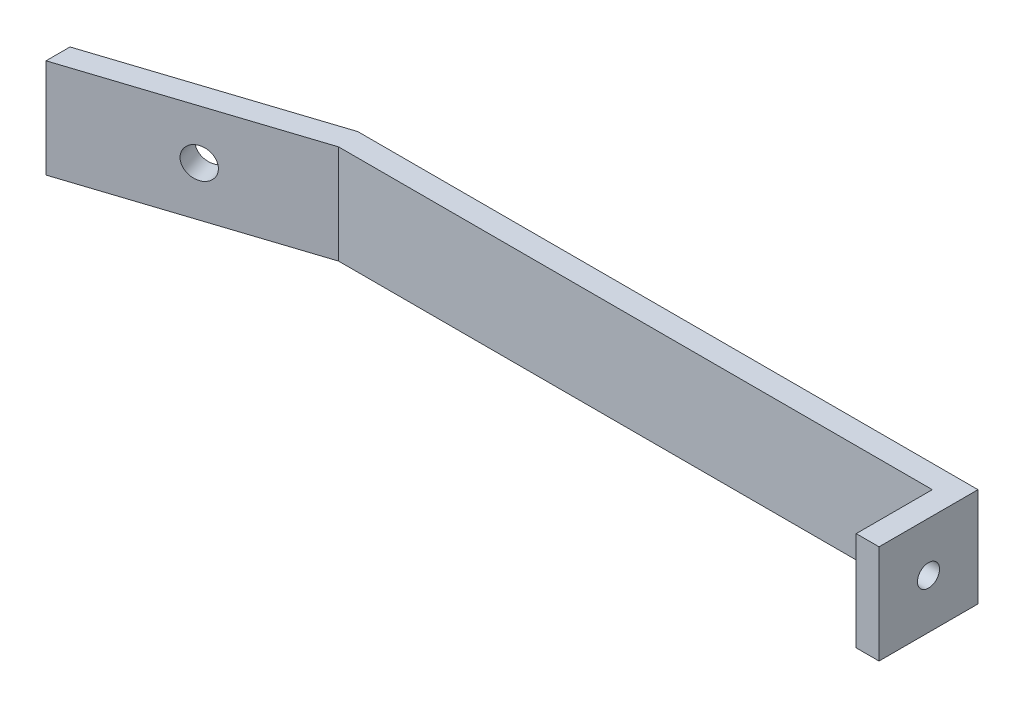
ISO-10303-21;
HEADER;
FILE_DESCRIPTION(('STEP AP214'),'2;1');
FILE_NAME('part.step','',(''),(''),'','','');
FILE_SCHEMA(('AUTOMOTIVE_DESIGN { 1 0 10303 214 1 1 1 1 }'));
ENDSEC;
DATA;
#1=APPLICATION_CONTEXT('core data for automotive mechanical design processes');
#2=APPLICATION_PROTOCOL_DEFINITION('international standard','automotive_design',2000,#1);
#3=PRODUCT_CONTEXT('',#1,'mechanical');
#4=PRODUCT('Part','Part','',(#3));
#5=PRODUCT_RELATED_PRODUCT_CATEGORY('part','',(#4));
#6=PRODUCT_DEFINITION_FORMATION('','',#4);
#7=PRODUCT_DEFINITION_CONTEXT('part definition',#1,'design');
#8=PRODUCT_DEFINITION('design','',#6,#7);
#9=PRODUCT_DEFINITION_SHAPE('','',#8);
#10=(LENGTH_UNIT() NAMED_UNIT(*) SI_UNIT(.MILLI.,.METRE.));
#11=(NAMED_UNIT(*) PLANE_ANGLE_UNIT() SI_UNIT($,.RADIAN.));
#12=(NAMED_UNIT(*) SI_UNIT($,.STERADIAN.) SOLID_ANGLE_UNIT());
#13=UNCERTAINTY_MEASURE_WITH_UNIT(LENGTH_MEASURE(1.E-05),#10,'distance_accuracy_value','');
#14=(GEOMETRIC_REPRESENTATION_CONTEXT(3) GLOBAL_UNCERTAINTY_ASSIGNED_CONTEXT((#13)) GLOBAL_UNIT_ASSIGNED_CONTEXT((#10,
#11,#12)) REPRESENTATION_CONTEXT('',''));
#15=CARTESIAN_POINT('',(0.,0.,0.));
#16=DIRECTION('',(0.,0.,1.));
#17=DIRECTION('',(1.,0.,0.));
#18=AXIS2_PLACEMENT_3D('',#15,#16,#17);
#19=CARTESIAN_POINT('',(55.,6.5,3.));
#20=DIRECTION('',(0.,0.,-1.));
#21=DIRECTION('',(-1.,0.,0.));
#22=AXIS2_PLACEMENT_3D('',#19,#20,#21);
#23=PLANE('',#22);
#24=DIRECTION('',(0.,-1.,0.));
#25=VECTOR('',#24,1.);
#26=CARTESIAN_POINT('',(52.,6.5,2.99999999999999));
#27=LINE('',#26,#25);
#28=CARTESIAN_POINT('',(52.,6.5,3.));
#29=VERTEX_POINT('',#28);
#30=CARTESIAN_POINT('',(52.,-6.5,3.));
#31=VERTEX_POINT('',#30);
#32=EDGE_CURVE('E51',#29,#31,#27,.T.);
#33=ORIENTED_EDGE('',*,*,#32,.F.);
#34=DIRECTION('',(1.,0.,0.));
#35=VECTOR('',#34,1.);
#36=CARTESIAN_POINT('',(55.,6.5,3.));
#37=LINE('',#36,#35);
#38=CARTESIAN_POINT('',(-25.9931511901718,6.5,2.99999999999998));
#39=VERTEX_POINT('',#38);
#40=EDGE_CURVE('E138',#39,#29,#37,.T.);
#41=ORIENTED_EDGE('',*,*,#40,.F.);
#42=DIRECTION('',(0.,-1.,0.));
#43=VECTOR('',#42,1.);
#44=CARTESIAN_POINT('',(-25.9931511901718,6.5,2.99999999999998));
#45=LINE('',#44,#43);
#46=CARTESIAN_POINT('',(-25.9931511901718,-6.5,2.99999999999998));
#47=VERTEX_POINT('',#46);
#48=EDGE_CURVE('E145',#39,#47,#45,.T.);
#49=ORIENTED_EDGE('',*,*,#48,.T.);
#50=DIRECTION('',(1.,0.,0.));
#51=VECTOR('',#50,1.);
#52=CARTESIAN_POINT('',(55.,-6.5,3.));
#53=LINE('',#52,#51);
#54=EDGE_CURVE('E56',#47,#31,#53,.T.);
#55=ORIENTED_EDGE('',*,*,#54,.T.);
#56=EDGE_LOOP('',(#33,#41,#49,#55));
#57=FACE_BOUND('',#56,.T.);
#58=ADVANCED_FACE('F34',(#57),#23,.F.);
#59=CARTESIAN_POINT('',(55.,6.5,50.));
#60=DIRECTION('',(-1.,0.,0.));
#61=DIRECTION('',(0.,0.,1.));
#62=AXIS2_PLACEMENT_3D('',#59,#60,#61);
#63=PLANE('',#62);
#64=CARTESIAN_POINT('',(55.,0.,6.5));
#65=DIRECTION('',(1.,0.,0.));
#66=DIRECTION('',(0.,0.,-1.));
#67=AXIS2_PLACEMENT_3D('',#64,#65,#66);
#68=CIRCLE('',#67,1.44883841646071);
#69=CARTESIAN_POINT('',(55.,0.,5.05116158353929));
#70=VERTEX_POINT('',#69);
#71=EDGE_CURVE('E124',#70,#70,#68,.T.);
#72=ORIENTED_EDGE('',*,*,#71,.F.);
#73=EDGE_LOOP('',(#72));
#74=FACE_BOUND('',#73,.T.);
#75=DIRECTION('',(0.,0.,-1.));
#76=VECTOR('',#75,1.);
#77=CARTESIAN_POINT('',(55.,6.5,50.));
#78=LINE('',#77,#76);
#79=CARTESIAN_POINT('',(55.,6.5,13.));
#80=VERTEX_POINT('',#79);
#81=CARTESIAN_POINT('',(55.,6.5,0.));
#82=VERTEX_POINT('',#81);
#83=EDGE_CURVE('E11',#80,#82,#78,.T.);
#84=ORIENTED_EDGE('',*,*,#83,.F.);
#85=DIRECTION('',(0.,1.,0.));
#86=VECTOR('',#85,1.);
#87=CARTESIAN_POINT('',(55.,6.5,13.));
#88=LINE('',#87,#86);
#89=CARTESIAN_POINT('',(55.,-6.5,13.));
#90=VERTEX_POINT('',#89);
#91=EDGE_CURVE('E101',#90,#80,#88,.T.);
#92=ORIENTED_EDGE('',*,*,#91,.F.);
#93=DIRECTION('',(0.,0.,-1.));
#94=VECTOR('',#93,1.);
#95=CARTESIAN_POINT('',(55.,-6.5,50.));
#96=LINE('',#95,#94);
#97=CARTESIAN_POINT('',(55.,-6.5,0.));
#98=VERTEX_POINT('',#97);
#99=EDGE_CURVE('E165',#90,#98,#96,.T.);
#100=ORIENTED_EDGE('',*,*,#99,.T.);
#101=DIRECTION('',(0.,1.,0.));
#102=VECTOR('',#101,1.);
#103=CARTESIAN_POINT('',(55.,6.5,0.));
#104=LINE('',#103,#102);
#105=EDGE_CURVE('E103',#98,#82,#104,.T.);
#106=ORIENTED_EDGE('',*,*,#105,.T.);
#107=EDGE_LOOP('',(#84,#92,#100,#106));
#108=FACE_BOUND('',#107,.T.);
#109=ADVANCED_FACE('F36',(#74,#108),#63,.F.);
#110=CARTESIAN_POINT('',(-55.,6.5,50.));
#111=DIRECTION('',(0.,-1.,0.));
#112=DIRECTION('',(0.,0.,-1.));
#113=AXIS2_PLACEMENT_3D('',#110,#111,#112);
#114=PLANE('',#113);
#115=DIRECTION('',(0.951056516295153,0.,-0.309016994374948));
#116=VECTOR('',#115,1.);
#117=CARTESIAN_POINT('',(-55.,6.5,12.4248965039633));
#118=LINE('',#117,#116);
#119=CARTESIAN_POINT('',(-55.,6.5,12.4248965039633));
#120=VERTEX_POINT('',#119);
#121=EDGE_CURVE('E136',#120,#39,#118,.T.);
#122=ORIENTED_EDGE('',*,*,#121,.T.);
#123=ORIENTED_EDGE('',*,*,#40,.T.);
#124=DIRECTION('',(0.,0.,-1.));
#125=VECTOR('',#124,1.);
#126=CARTESIAN_POINT('',(52.,6.5,13.));
#127=LINE('',#126,#125);
#128=CARTESIAN_POINT('',(52.,6.5,13.));
#129=VERTEX_POINT('',#128);
#130=EDGE_CURVE('E112',#129,#29,#127,.T.);
#131=ORIENTED_EDGE('',*,*,#130,.F.);
#132=DIRECTION('',(-1.,0.,0.));
#133=VECTOR('',#132,1.);
#134=CARTESIAN_POINT('',(55.,6.5,13.));
#135=LINE('',#134,#133);
#136=EDGE_CURVE('E108',#80,#129,#135,.T.);
#137=ORIENTED_EDGE('',*,*,#136,.F.);
#138=ORIENTED_EDGE('',*,*,#83,.T.);
#139=DIRECTION('',(-1.,0.,0.));
#140=VECTOR('',#139,1.);
#141=CARTESIAN_POINT('',(-55.,6.5,0.));
#142=LINE('',#141,#140);
#143=CARTESIAN_POINT('',(-26.4683045111454,6.5,0.));
#144=VERTEX_POINT('',#143);
#145=EDGE_CURVE('E160',#82,#144,#142,.T.);
#146=ORIENTED_EDGE('',*,*,#145,.T.);
#147=DIRECTION('',(-0.951056516295153,0.,0.309016994374948));
#148=VECTOR('',#147,1.);
#149=CARTESIAN_POINT('',(-55.,6.5,9.27050983124845));
#150=LINE('',#149,#148);
#151=CARTESIAN_POINT('',(-55.,6.5,9.27050983124845));
#152=VERTEX_POINT('',#151);
#153=EDGE_CURVE('E149',#144,#152,#150,.T.);
#154=ORIENTED_EDGE('',*,*,#153,.T.);
#155=DIRECTION('',(0.,0.,-1.));
#156=VECTOR('',#155,1.);
#157=CARTESIAN_POINT('',(-55.,6.5,50.));
#158=LINE('',#157,#156);
#159=EDGE_CURVE('E43',#120,#152,#158,.T.);
#160=ORIENTED_EDGE('',*,*,#159,.F.);
#161=EDGE_LOOP('',(#122,#123,#131,#137,#138,#146,#154,#160));
#162=FACE_BOUND('',#161,.T.);
#163=ADVANCED_FACE('F110',(#162),#114,.F.);
#164=CARTESIAN_POINT('',(-55.,6.5,50.));
#165=DIRECTION('',(1.,0.,0.));
#166=DIRECTION('',(0.,0.,-1.));
#167=AXIS2_PLACEMENT_3D('',#164,#165,#166);
#168=PLANE('',#167);
#169=DIRECTION('',(0.,0.,-1.));
#170=VECTOR('',#169,1.);
#171=CARTESIAN_POINT('',(-55.,-6.5,50.));
#172=LINE('',#171,#170);
#173=CARTESIAN_POINT('',(-55.,-6.5,12.4248965039633));
#174=VERTEX_POINT('',#173);
#175=CARTESIAN_POINT('',(-55.,-6.5,9.27050983124845));
#176=VERTEX_POINT('',#175);
#177=EDGE_CURVE('E167',#174,#176,#172,.T.);
#178=ORIENTED_EDGE('',*,*,#177,.F.);
#179=DIRECTION('',(0.,-1.,0.));
#180=VECTOR('',#179,1.);
#181=CARTESIAN_POINT('',(-55.,6.5,12.4248965039633));
#182=LINE('',#181,#180);
#183=EDGE_CURVE('E140',#120,#174,#182,.T.);
#184=ORIENTED_EDGE('',*,*,#183,.F.);
#185=ORIENTED_EDGE('',*,*,#159,.T.);
#186=DIRECTION('',(0.,-1.,0.));
#187=VECTOR('',#186,1.);
#188=CARTESIAN_POINT('',(-55.,6.5,9.27050983124845));
#189=LINE('',#188,#187);
#190=EDGE_CURVE('E155',#152,#176,#189,.T.);
#191=ORIENTED_EDGE('',*,*,#190,.T.);
#192=EDGE_LOOP('',(#178,#184,#185,#191));
#193=FACE_BOUND('',#192,.T.);
#194=ADVANCED_FACE('F205',(#193),#168,.F.);
#195=CARTESIAN_POINT('',(-55.,-6.5,50.));
#196=DIRECTION('',(0.,1.,0.));
#197=DIRECTION('',(0.,0.,1.));
#198=AXIS2_PLACEMENT_3D('',#195,#196,#197);
#199=PLANE('',#198);
#200=ORIENTED_EDGE('',*,*,#99,.F.);
#201=DIRECTION('',(1.,0.,0.));
#202=VECTOR('',#201,1.);
#203=CARTESIAN_POINT('',(55.,-6.5,13.));
#204=LINE('',#203,#202);
#205=CARTESIAN_POINT('',(52.,-6.5,13.));
#206=VERTEX_POINT('',#205);
#207=EDGE_CURVE('E120',#206,#90,#204,.T.);
#208=ORIENTED_EDGE('',*,*,#207,.F.);
#209=DIRECTION('',(0.,0.,-1.));
#210=VECTOR('',#209,1.);
#211=CARTESIAN_POINT('',(52.,-6.5,13.));
#212=LINE('',#211,#210);
#213=EDGE_CURVE('E127',#206,#31,#212,.T.);
#214=ORIENTED_EDGE('',*,*,#213,.T.);
#215=ORIENTED_EDGE('',*,*,#54,.F.);
#216=DIRECTION('',(0.951056516295153,0.,-0.309016994374948));
#217=VECTOR('',#216,1.);
#218=CARTESIAN_POINT('',(-55.,-6.5,12.4248965039633));
#219=LINE('',#218,#217);
#220=EDGE_CURVE('E141',#174,#47,#219,.T.);
#221=ORIENTED_EDGE('',*,*,#220,.F.);
#222=ORIENTED_EDGE('',*,*,#177,.T.);
#223=DIRECTION('',(-0.951056516295153,0.,0.309016994374948));
#224=VECTOR('',#223,1.);
#225=CARTESIAN_POINT('',(-55.,-6.5,9.27050983124845));
#226=LINE('',#225,#224);
#227=CARTESIAN_POINT('',(-26.4683045111454,-6.5,0.));
#228=VERTEX_POINT('',#227);
#229=EDGE_CURVE('E147',#228,#176,#226,.T.);
#230=ORIENTED_EDGE('',*,*,#229,.F.);
#231=DIRECTION('',(1.,0.,0.));
#232=VECTOR('',#231,1.);
#233=CARTESIAN_POINT('',(-55.,-6.5,0.));
#234=LINE('',#233,#232);
#235=EDGE_CURVE('E162',#228,#98,#234,.T.);
#236=ORIENTED_EDGE('',*,*,#235,.T.);
#237=EDGE_LOOP('',(#200,#208,#214,#215,#221,#222,#230,#236));
#238=FACE_BOUND('',#237,.T.);
#239=ADVANCED_FACE('F201',(#238),#199,.F.);
#240=CARTESIAN_POINT('',(0.,0.,0.));
#241=DIRECTION('',(0.,0.,1.));
#242=DIRECTION('',(1.,0.,0.));
#243=AXIS2_PLACEMENT_3D('',#240,#241,#242);
#244=PLANE('',#243);
#245=ORIENTED_EDGE('',*,*,#235,.F.);
#246=DIRECTION('',(0.,-1.,0.));
#247=VECTOR('',#246,1.);
#248=CARTESIAN_POINT('',(-26.4683045111454,6.5,0.));
#249=LINE('',#248,#247);
#250=EDGE_CURVE('E152',#144,#228,#249,.T.);
#251=ORIENTED_EDGE('',*,*,#250,.F.);
#252=ORIENTED_EDGE('',*,*,#145,.F.);
#253=ORIENTED_EDGE('',*,*,#105,.F.);
#254=EDGE_LOOP('',(#245,#251,#252,#253));
#255=FACE_BOUND('',#254,.T.);
#256=ADVANCED_FACE('F197',(#255),#244,.F.);
#257=CARTESIAN_POINT('',(-55.,6.5,9.27050983124845));
#258=DIRECTION('',(0.309016994374948,0.,0.951056516295153));
#259=DIRECTION('',(0.951056516295153,0.,-0.309016994374949));
#260=AXIS2_PLACEMENT_3D('',#257,#258,#259);
#261=PLANE('',#260);
#262=CARTESIAN_POINT('',(-40.7341522555727,0.,4.63525491562422));
#263=DIRECTION('',(-0.309016994374948,0.,-0.951056516295153));
#264=DIRECTION('',(-0.951056516295153,0.,0.309016994374948));
#265=AXIS2_PLACEMENT_3D('',#262,#263,#264);
#266=CIRCLE('',#265,2.);
#267=CARTESIAN_POINT('',(-42.636265288163,0.,5.25328890437412));
#268=VERTEX_POINT('',#267);
#269=EDGE_CURVE('E132',#268,#268,#266,.T.);
#270=ORIENTED_EDGE('',*,*,#269,.F.);
#271=EDGE_LOOP('',(#270));
#272=FACE_BOUND('',#271,.T.);
#273=ORIENTED_EDGE('',*,*,#229,.T.);
#274=ORIENTED_EDGE('',*,*,#190,.F.);
#275=ORIENTED_EDGE('',*,*,#153,.F.);
#276=ORIENTED_EDGE('',*,*,#250,.T.);
#277=EDGE_LOOP('',(#273,#274,#275,#276));
#278=FACE_BOUND('',#277,.T.);
#279=ADVANCED_FACE('F186',(#272,#278),#261,.F.);
#280=CARTESIAN_POINT('',(-55.,6.5,12.4248965039633));
#281=DIRECTION('',(-0.309016994374948,0.,-0.951056516295153));
#282=DIRECTION('',(-0.951056516295153,0.,0.309016994374948));
#283=AXIS2_PLACEMENT_3D('',#280,#281,#282);
#284=PLANE('',#283);
#285=CARTESIAN_POINT('',(-39.8071012724479,0.,7.48842446450968));
#286=DIRECTION('',(-0.309016994374948,0.,-0.951056516295153));
#287=DIRECTION('',(-0.951056516295153,0.,0.309016994374948));
#288=AXIS2_PLACEMENT_3D('',#285,#286,#287);
#289=CIRCLE('',#288,2.);
#290=CARTESIAN_POINT('',(-41.7092143050382,0.,8.10645845325958));
#291=VERTEX_POINT('',#290);
#292=EDGE_CURVE('E135',#291,#291,#289,.T.);
#293=ORIENTED_EDGE('',*,*,#292,.T.);
#294=EDGE_LOOP('',(#293));
#295=FACE_BOUND('',#294,.T.);
#296=ORIENTED_EDGE('',*,*,#220,.T.);
#297=ORIENTED_EDGE('',*,*,#48,.F.);
#298=ORIENTED_EDGE('',*,*,#121,.F.);
#299=ORIENTED_EDGE('',*,*,#183,.T.);
#300=EDGE_LOOP('',(#296,#297,#298,#299));
#301=FACE_BOUND('',#300,.T.);
#302=ADVANCED_FACE('F172',(#295,#301),#284,.F.);
#303=CARTESIAN_POINT('',(-29.3030359630699,0.,39.8166133405958));
#304=DIRECTION('',(-0.309016994374948,0.,-0.951056516295153));
#305=DIRECTION('',(-0.951056516295153,0.,0.309016994374948));
#306=AXIS2_PLACEMENT_3D('',#303,#304,#305);
#307=CYLINDRICAL_SURFACE('',#306,2.);
#308=ORIENTED_EDGE('',*,*,#269,.T.);
#309=EDGE_LOOP('',(#308));
#310=FACE_BOUND('',#309,.T.);
#311=ORIENTED_EDGE('',*,*,#292,.F.);
#312=EDGE_LOOP('',(#311));
#313=FACE_BOUND('',#312,.T.);
#314=ADVANCED_FACE('F175',(#310,#313),#307,.F.);
#315=CARTESIAN_POINT('',(52.,6.5,13.));
#316=DIRECTION('',(1.,0.,0.));
#317=DIRECTION('',(0.,0.,-1.));
#318=AXIS2_PLACEMENT_3D('',#315,#316,#317);
#319=PLANE('',#318);
#320=CARTESIAN_POINT('',(52.,0.,6.5));
#321=DIRECTION('',(1.,0.,0.));
#322=DIRECTION('',(0.,0.,-1.));
#323=AXIS2_PLACEMENT_3D('',#320,#321,#322);
#324=CIRCLE('',#323,1.44883841646071);
#325=CARTESIAN_POINT('',(52.,0.,5.05116158353929));
#326=VERTEX_POINT('',#325);
#327=EDGE_CURVE('E38',#326,#326,#324,.T.);
#328=ORIENTED_EDGE('',*,*,#327,.T.);
#329=EDGE_LOOP('',(#328));
#330=FACE_BOUND('',#329,.T.);
#331=ORIENTED_EDGE('',*,*,#32,.T.);
#332=ORIENTED_EDGE('',*,*,#213,.F.);
#333=DIRECTION('',(0.,-1.,0.));
#334=VECTOR('',#333,1.);
#335=CARTESIAN_POINT('',(52.,6.5,13.));
#336=LINE('',#335,#334);
#337=EDGE_CURVE('E115',#129,#206,#336,.T.);
#338=ORIENTED_EDGE('',*,*,#337,.F.);
#339=ORIENTED_EDGE('',*,*,#130,.T.);
#340=EDGE_LOOP('',(#331,#332,#338,#339));
#341=FACE_BOUND('',#340,.T.);
#342=ADVANCED_FACE('F177',(#330,#341),#319,.F.);
#343=CARTESIAN_POINT('',(0.,0.,13.));
#344=DIRECTION('',(0.,0.,-1.));
#345=DIRECTION('',(-1.,0.,0.));
#346=AXIS2_PLACEMENT_3D('',#343,#344,#345);
#347=PLANE('',#346);
#348=ORIENTED_EDGE('',*,*,#91,.T.);
#349=ORIENTED_EDGE('',*,*,#136,.T.);
#350=ORIENTED_EDGE('',*,*,#337,.T.);
#351=ORIENTED_EDGE('',*,*,#207,.T.);
#352=EDGE_LOOP('',(#348,#349,#350,#351));
#353=FACE_BOUND('',#352,.T.);
#354=ADVANCED_FACE('F118',(#353),#347,.F.);
#355=CARTESIAN_POINT('',(43.,0.,6.5));
#356=DIRECTION('',(1.,0.,0.));
#357=DIRECTION('',(0.,0.,-1.));
#358=AXIS2_PLACEMENT_3D('',#355,#356,#357);
#359=CYLINDRICAL_SURFACE('',#358,1.44883841646071);
#360=ORIENTED_EDGE('',*,*,#71,.T.);
#361=EDGE_LOOP('',(#360));
#362=FACE_BOUND('',#361,.T.);
#363=ORIENTED_EDGE('',*,*,#327,.F.);
#364=EDGE_LOOP('',(#363));
#365=FACE_BOUND('',#364,.T.);
#366=ADVANCED_FACE('F275',(#362,#365),#359,.F.);
#367=CLOSED_SHELL('',(#58,#109,#163,#194,#239,#256,#279,#302,#314,#342,#354,#366));
#368=MANIFOLD_SOLID_BREP('B2',#367);
#369=ADVANCED_BREP_SHAPE_REPRESENTATION('',(#18,#368),#14);
#370=SHAPE_DEFINITION_REPRESENTATION(#9,#369);
ENDSEC;
END-ISO-10303-21;
